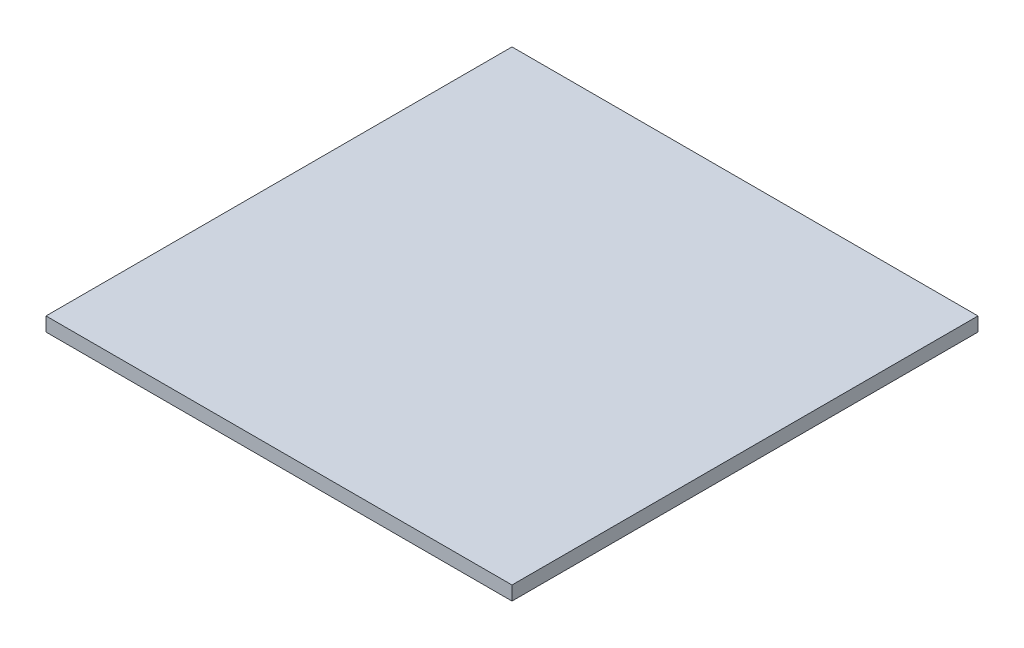
ISO-10303-21;
HEADER;
FILE_DESCRIPTION(('STEP AP214'),'2;1');
FILE_NAME('part.step','',(''),(''),'','','');
FILE_SCHEMA(('AUTOMOTIVE_DESIGN { 1 0 10303 214 1 1 1 1 }'));
ENDSEC;
DATA;
#1=APPLICATION_CONTEXT('core data for automotive mechanical design processes');
#2=APPLICATION_PROTOCOL_DEFINITION('international standard','automotive_design',2000,#1);
#3=PRODUCT_CONTEXT('',#1,'mechanical');
#4=PRODUCT('Part','Part','',(#3));
#5=PRODUCT_RELATED_PRODUCT_CATEGORY('part','',(#4));
#6=PRODUCT_DEFINITION_FORMATION('','',#4);
#7=PRODUCT_DEFINITION_CONTEXT('part definition',#1,'design');
#8=PRODUCT_DEFINITION('design','',#6,#7);
#9=PRODUCT_DEFINITION_SHAPE('','',#8);
#10=(LENGTH_UNIT() NAMED_UNIT(*) SI_UNIT(.MILLI.,.METRE.));
#11=(NAMED_UNIT(*) PLANE_ANGLE_UNIT() SI_UNIT($,.RADIAN.));
#12=(NAMED_UNIT(*) SI_UNIT($,.STERADIAN.) SOLID_ANGLE_UNIT());
#13=UNCERTAINTY_MEASURE_WITH_UNIT(LENGTH_MEASURE(1.E-05),#10,'distance_accuracy_value','');
#14=(GEOMETRIC_REPRESENTATION_CONTEXT(3) GLOBAL_UNCERTAINTY_ASSIGNED_CONTEXT((#13)) GLOBAL_UNIT_ASSIGNED_CONTEXT((#10,
#11,#12)) REPRESENTATION_CONTEXT('',''));
#15=CARTESIAN_POINT('',(0.,0.,0.));
#16=DIRECTION('',(0.,0.,1.));
#17=DIRECTION('',(1.,0.,0.));
#18=AXIS2_PLACEMENT_3D('',#15,#16,#17);
#19=CARTESIAN_POINT('',(25.4,1.524,-25.4));
#20=DIRECTION('',(-1.,0.,0.));
#21=DIRECTION('',(0.,0.,1.));
#22=AXIS2_PLACEMENT_3D('',#19,#20,#21);
#23=PLANE('',#22);
#24=DIRECTION('',(0.,0.,-1.));
#25=VECTOR('',#24,1.);
#26=CARTESIAN_POINT('',(25.4,0.,-25.4));
#27=LINE('',#26,#25);
#28=CARTESIAN_POINT('',(25.4,0.,25.4));
#29=VERTEX_POINT('',#28);
#30=CARTESIAN_POINT('',(25.4,0.,-25.4));
#31=VERTEX_POINT('',#30);
#32=EDGE_CURVE('E107',#29,#31,#27,.T.);
#33=ORIENTED_EDGE('',*,*,#32,.T.);
#34=DIRECTION('',(0.,-1.,0.));
#35=VECTOR('',#34,1.);
#36=CARTESIAN_POINT('',(25.4,1.524,-25.4));
#37=LINE('',#36,#35);
#38=CARTESIAN_POINT('',(25.4,1.524,-25.4));
#39=VERTEX_POINT('',#38);
#40=EDGE_CURVE('E11',#39,#31,#37,.T.);
#41=ORIENTED_EDGE('',*,*,#40,.F.);
#42=DIRECTION('',(0.,0.,-1.));
#43=VECTOR('',#42,1.);
#44=CARTESIAN_POINT('',(25.4,1.524,-25.4));
#45=LINE('',#44,#43);
#46=CARTESIAN_POINT('',(25.4,1.524,25.4));
#47=VERTEX_POINT('',#46);
#48=EDGE_CURVE('E91',#47,#39,#45,.T.);
#49=ORIENTED_EDGE('',*,*,#48,.F.);
#50=DIRECTION('',(0.,-1.,0.));
#51=VECTOR('',#50,1.);
#52=CARTESIAN_POINT('',(25.4,1.524,25.4));
#53=LINE('',#52,#51);
#54=EDGE_CURVE('E103',#47,#29,#53,.T.);
#55=ORIENTED_EDGE('',*,*,#54,.T.);
#56=EDGE_LOOP('',(#33,#41,#49,#55));
#57=FACE_BOUND('',#56,.T.);
#58=ADVANCED_FACE('F39',(#57),#23,.F.);
#59=CARTESIAN_POINT('',(-25.3999999999999,1.524,-25.4));
#60=DIRECTION('',(0.,0.,1.));
#61=DIRECTION('',(1.,0.,0.));
#62=AXIS2_PLACEMENT_3D('',#59,#60,#61);
#63=PLANE('',#62);
#64=DIRECTION('',(-1.,0.,0.));
#65=VECTOR('',#64,1.);
#66=CARTESIAN_POINT('',(-25.3999999999999,0.,-25.4));
#67=LINE('',#66,#65);
#68=CARTESIAN_POINT('',(-25.3999999999999,0.,-25.4));
#69=VERTEX_POINT('',#68);
#70=EDGE_CURVE('E96',#31,#69,#67,.T.);
#71=ORIENTED_EDGE('',*,*,#70,.T.);
#72=DIRECTION('',(0.,-1.,0.));
#73=VECTOR('',#72,1.);
#74=CARTESIAN_POINT('',(-25.3999999999999,1.524,-25.4));
#75=LINE('',#74,#73);
#76=CARTESIAN_POINT('',(-25.3999999999999,1.524,-25.4));
#77=VERTEX_POINT('',#76);
#78=EDGE_CURVE('E48',#77,#69,#75,.T.);
#79=ORIENTED_EDGE('',*,*,#78,.F.);
#80=DIRECTION('',(-1.,0.,0.));
#81=VECTOR('',#80,1.);
#82=CARTESIAN_POINT('',(-25.3999999999999,1.524,-25.4));
#83=LINE('',#82,#81);
#84=EDGE_CURVE('E86',#39,#77,#83,.T.);
#85=ORIENTED_EDGE('',*,*,#84,.F.);
#86=ORIENTED_EDGE('',*,*,#40,.T.);
#87=EDGE_LOOP('',(#71,#79,#85,#86));
#88=FACE_BOUND('',#87,.T.);
#89=ADVANCED_FACE('F95',(#88),#63,.F.);
#90=CARTESIAN_POINT('',(-25.3999999999999,1.524,-25.4));
#91=DIRECTION('',(1.,0.,0.));
#92=DIRECTION('',(0.,0.,-1.));
#93=AXIS2_PLACEMENT_3D('',#90,#91,#92);
#94=PLANE('',#93);
#95=DIRECTION('',(0.,0.,1.));
#96=VECTOR('',#95,1.);
#97=CARTESIAN_POINT('',(-25.3999999999999,0.,-25.4));
#98=LINE('',#97,#96);
#99=CARTESIAN_POINT('',(-25.3999999999999,0.,25.4));
#100=VERTEX_POINT('',#99);
#101=EDGE_CURVE('E73',#69,#100,#98,.T.);
#102=ORIENTED_EDGE('',*,*,#101,.T.);
#103=DIRECTION('',(0.,-1.,0.));
#104=VECTOR('',#103,1.);
#105=CARTESIAN_POINT('',(-25.3999999999999,1.524,25.4));
#106=LINE('',#105,#104);
#107=CARTESIAN_POINT('',(-25.3999999999999,1.524,25.4));
#108=VERTEX_POINT('',#107);
#109=EDGE_CURVE('E98',#108,#100,#106,.T.);
#110=ORIENTED_EDGE('',*,*,#109,.F.);
#111=DIRECTION('',(0.,0.,1.));
#112=VECTOR('',#111,1.);
#113=CARTESIAN_POINT('',(-25.3999999999999,1.524,-25.4));
#114=LINE('',#113,#112);
#115=EDGE_CURVE('E89',#77,#108,#114,.T.);
#116=ORIENTED_EDGE('',*,*,#115,.F.);
#117=ORIENTED_EDGE('',*,*,#78,.T.);
#118=EDGE_LOOP('',(#102,#110,#116,#117));
#119=FACE_BOUND('',#118,.T.);
#120=ADVANCED_FACE('F99',(#119),#94,.F.);
#121=CARTESIAN_POINT('',(-25.3999999999999,1.524,25.4));
#122=DIRECTION('',(0.,0.,-1.));
#123=DIRECTION('',(-1.,0.,0.));
#124=AXIS2_PLACEMENT_3D('',#121,#122,#123);
#125=PLANE('',#124);
#126=DIRECTION('',(1.,0.,0.));
#127=VECTOR('',#126,1.);
#128=CARTESIAN_POINT('',(-25.3999999999999,0.,25.4));
#129=LINE('',#128,#127);
#130=EDGE_CURVE('E79',#100,#29,#129,.T.);
#131=ORIENTED_EDGE('',*,*,#130,.T.);
#132=ORIENTED_EDGE('',*,*,#54,.F.);
#133=DIRECTION('',(1.,0.,0.));
#134=VECTOR('',#133,1.);
#135=CARTESIAN_POINT('',(-25.3999999999999,1.524,25.4));
#136=LINE('',#135,#134);
#137=EDGE_CURVE('E56',#108,#47,#136,.T.);
#138=ORIENTED_EDGE('',*,*,#137,.F.);
#139=ORIENTED_EDGE('',*,*,#109,.T.);
#140=EDGE_LOOP('',(#131,#132,#138,#139));
#141=FACE_BOUND('',#140,.T.);
#142=ADVANCED_FACE('F120',(#141),#125,.F.);
#143=CARTESIAN_POINT('',(0.,1.524,0.));
#144=DIRECTION('',(0.,1.,0.));
#145=DIRECTION('',(0.,0.,1.));
#146=AXIS2_PLACEMENT_3D('',#143,#144,#145);
#147=PLANE('',#146);
#148=ORIENTED_EDGE('',*,*,#48,.T.);
#149=ORIENTED_EDGE('',*,*,#84,.T.);
#150=ORIENTED_EDGE('',*,*,#115,.T.);
#151=ORIENTED_EDGE('',*,*,#137,.T.);
#152=EDGE_LOOP('',(#148,#149,#150,#151));
#153=FACE_BOUND('',#152,.T.);
#154=ADVANCED_FACE('F87',(#153),#147,.T.);
#155=CARTESIAN_POINT('',(0.,0.,0.));
#156=DIRECTION('',(0.,1.,0.));
#157=DIRECTION('',(0.,0.,1.));
#158=AXIS2_PLACEMENT_3D('',#155,#156,#157);
#159=PLANE('',#158);
#160=ORIENTED_EDGE('',*,*,#32,.F.);
#161=ORIENTED_EDGE('',*,*,#130,.F.);
#162=ORIENTED_EDGE('',*,*,#101,.F.);
#163=ORIENTED_EDGE('',*,*,#70,.F.);
#164=EDGE_LOOP('',(#160,#161,#162,#163));
#165=FACE_BOUND('',#164,.T.);
#166=ADVANCED_FACE('F123',(#165),#159,.F.);
#167=CLOSED_SHELL('',(#58,#89,#120,#142,#154,#166));
#168=MANIFOLD_SOLID_BREP('B2',#167);
#169=ADVANCED_BREP_SHAPE_REPRESENTATION('',(#18,#168),#14);
#170=SHAPE_DEFINITION_REPRESENTATION(#9,#169);
ENDSEC;
END-ISO-10303-21;
